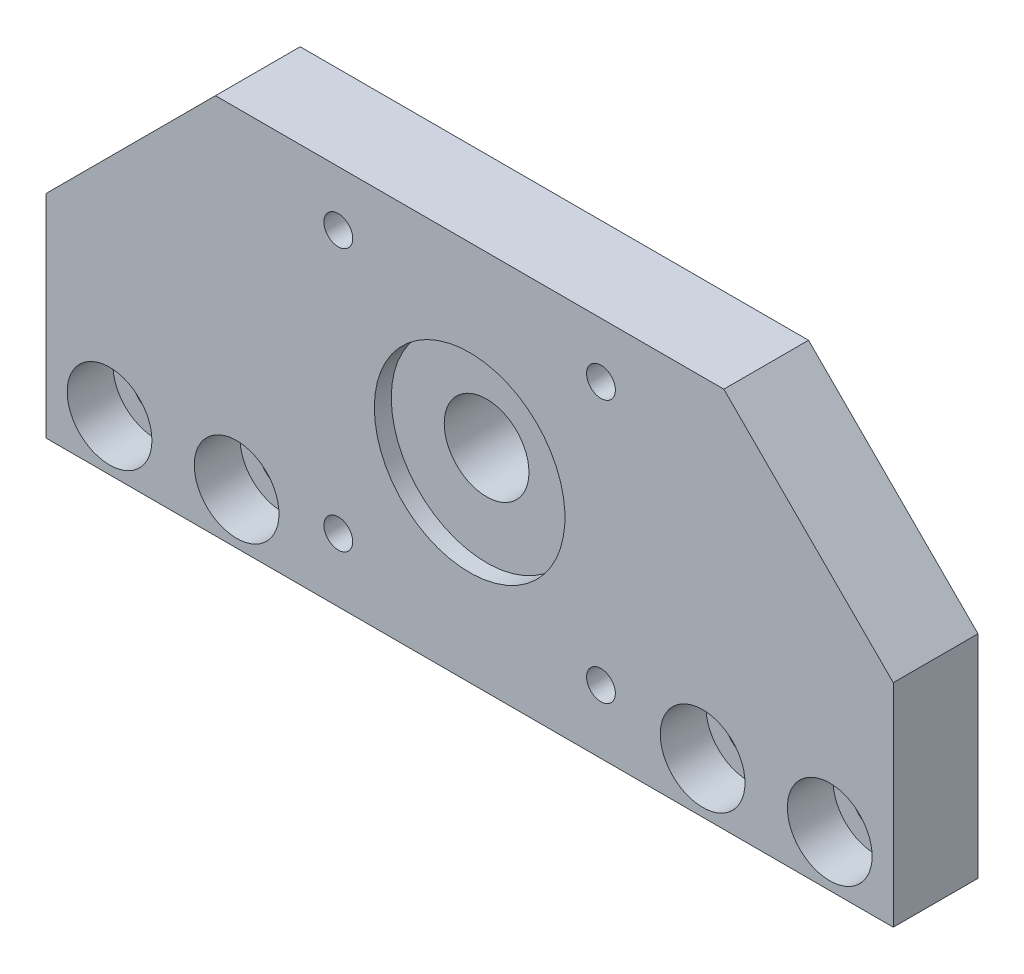
ISO-10303-21;
HEADER;
FILE_DESCRIPTION(('STEP AP214'),'2;1');
FILE_NAME('part.step','',(''),(''),'','','');
FILE_SCHEMA(('AUTOMOTIVE_DESIGN { 1 0 10303 214 1 1 1 1 }'));
ENDSEC;
DATA;
#1=APPLICATION_CONTEXT('core data for automotive mechanical design processes');
#2=APPLICATION_PROTOCOL_DEFINITION('international standard','automotive_design',2000,#1);
#3=PRODUCT_CONTEXT('',#1,'mechanical');
#4=PRODUCT('Part','Part','',(#3));
#5=PRODUCT_RELATED_PRODUCT_CATEGORY('part','',(#4));
#6=PRODUCT_DEFINITION_FORMATION('','',#4);
#7=PRODUCT_DEFINITION_CONTEXT('part definition',#1,'design');
#8=PRODUCT_DEFINITION('design','',#6,#7);
#9=PRODUCT_DEFINITION_SHAPE('','',#8);
#10=(LENGTH_UNIT() NAMED_UNIT(*) SI_UNIT(.MILLI.,.METRE.));
#11=(NAMED_UNIT(*) PLANE_ANGLE_UNIT() SI_UNIT($,.RADIAN.));
#12=(NAMED_UNIT(*) SI_UNIT($,.STERADIAN.) SOLID_ANGLE_UNIT());
#13=UNCERTAINTY_MEASURE_WITH_UNIT(LENGTH_MEASURE(1.E-05),#10,'distance_accuracy_value','');
#14=(GEOMETRIC_REPRESENTATION_CONTEXT(3) GLOBAL_UNCERTAINTY_ASSIGNED_CONTEXT((#13)) GLOBAL_UNIT_ASSIGNED_CONTEXT((#10,
#11,#12)) REPRESENTATION_CONTEXT('',''));
#15=CARTESIAN_POINT('',(0.,0.,0.));
#16=DIRECTION('',(0.,0.,1.));
#17=DIRECTION('',(1.,0.,0.));
#18=AXIS2_PLACEMENT_3D('',#15,#16,#17);
#19=CARTESIAN_POINT('',(-50.,-22.5,5.));
#20=DIRECTION('',(1.,0.,0.));
#21=DIRECTION('',(0.,0.,-1.));
#22=AXIS2_PLACEMENT_3D('',#19,#20,#21);
#23=PLANE('',#22);
#24=DIRECTION('',(0.,-1.,0.));
#25=VECTOR('',#24,1.);
#26=CARTESIAN_POINT('',(-50.,-22.5,5.));
#27=LINE('',#26,#25);
#28=CARTESIAN_POINT('',(-50.,2.49999999999997,5.));
#29=VERTEX_POINT('',#28);
#30=CARTESIAN_POINT('',(-50.,-22.5,5.));
#31=VERTEX_POINT('',#30);
#32=EDGE_CURVE('E94',#29,#31,#27,.T.);
#33=ORIENTED_EDGE('',*,*,#32,.F.);
#34=DIRECTION('',(0.,0.,-1.));
#35=VECTOR('',#34,1.);
#36=CARTESIAN_POINT('',(-50.,2.49999999999998,5.));
#37=LINE('',#36,#35);
#38=CARTESIAN_POINT('',(-50.,2.49999999999997,-5.));
#39=VERTEX_POINT('',#38);
#40=EDGE_CURVE('E11',#29,#39,#37,.T.);
#41=ORIENTED_EDGE('',*,*,#40,.T.);
#42=DIRECTION('',(0.,-1.,0.));
#43=VECTOR('',#42,1.);
#44=CARTESIAN_POINT('',(-50.,-22.5,-5.));
#45=LINE('',#44,#43);
#46=CARTESIAN_POINT('',(-50.,-22.5,-5.));
#47=VERTEX_POINT('',#46);
#48=EDGE_CURVE('E113',#39,#47,#45,.T.);
#49=ORIENTED_EDGE('',*,*,#48,.T.);
#50=DIRECTION('',(0.,0.,-1.));
#51=VECTOR('',#50,1.);
#52=CARTESIAN_POINT('',(-50.,-22.5,5.));
#53=LINE('',#52,#51);
#54=EDGE_CURVE('E107',#31,#47,#53,.T.);
#55=ORIENTED_EDGE('',*,*,#54,.F.);
#56=EDGE_LOOP('',(#33,#41,#49,#55));
#57=FACE_BOUND('',#56,.T.);
#58=ADVANCED_FACE('F39',(#57),#23,.F.);
#59=CARTESIAN_POINT('',(50.,-22.5,5.));
#60=DIRECTION('',(0.,1.,0.));
#61=DIRECTION('',(-1.,0.,0.));
#62=AXIS2_PLACEMENT_3D('',#59,#60,#61);
#63=PLANE('',#62);
#64=DIRECTION('',(1.,0.,0.));
#65=VECTOR('',#64,1.);
#66=CARTESIAN_POINT('',(50.,-22.5,-5.));
#67=LINE('',#66,#65);
#68=CARTESIAN_POINT('',(50.,-22.5,-5.));
#69=VERTEX_POINT('',#68);
#70=EDGE_CURVE('E147',#47,#69,#67,.T.);
#71=ORIENTED_EDGE('',*,*,#70,.T.);
#72=DIRECTION('',(0.,0.,-1.));
#73=VECTOR('',#72,1.);
#74=CARTESIAN_POINT('',(50.,-22.5,5.));
#75=LINE('',#74,#73);
#76=CARTESIAN_POINT('',(50.,-22.5,5.));
#77=VERTEX_POINT('',#76);
#78=EDGE_CURVE('E109',#77,#69,#75,.T.);
#79=ORIENTED_EDGE('',*,*,#78,.F.);
#80=DIRECTION('',(1.,0.,0.));
#81=VECTOR('',#80,1.);
#82=CARTESIAN_POINT('',(50.,-22.5,5.));
#83=LINE('',#82,#81);
#84=EDGE_CURVE('E97',#31,#77,#83,.T.);
#85=ORIENTED_EDGE('',*,*,#84,.F.);
#86=ORIENTED_EDGE('',*,*,#54,.T.);
#87=EDGE_LOOP('',(#71,#79,#85,#86));
#88=FACE_BOUND('',#87,.T.);
#89=ADVANCED_FACE('F106',(#88),#63,.F.);
#90=CARTESIAN_POINT('',(50.,-22.5,5.));
#91=DIRECTION('',(-1.,0.,0.));
#92=DIRECTION('',(0.,0.,1.));
#93=AXIS2_PLACEMENT_3D('',#90,#91,#92);
#94=PLANE('',#93);
#95=DIRECTION('',(0.,1.,0.));
#96=VECTOR('',#95,1.);
#97=CARTESIAN_POINT('',(50.,-22.5,-5.));
#98=LINE('',#97,#96);
#99=CARTESIAN_POINT('',(50.,2.49999999999989,-5.));
#100=VERTEX_POINT('',#99);
#101=EDGE_CURVE('E145',#69,#100,#98,.T.);
#102=ORIENTED_EDGE('',*,*,#101,.T.);
#103=DIRECTION('',(0.,0.,1.));
#104=VECTOR('',#103,1.);
#105=CARTESIAN_POINT('',(50.,2.4999999999999,5.));
#106=LINE('',#105,#104);
#107=CARTESIAN_POINT('',(50.,2.49999999999989,5.));
#108=VERTEX_POINT('',#107);
#109=EDGE_CURVE('E64',#100,#108,#106,.T.);
#110=ORIENTED_EDGE('',*,*,#109,.T.);
#111=DIRECTION('',(0.,1.,0.));
#112=VECTOR('',#111,1.);
#113=CARTESIAN_POINT('',(50.,-22.5,5.));
#114=LINE('',#113,#112);
#115=EDGE_CURVE('E110',#77,#108,#114,.T.);
#116=ORIENTED_EDGE('',*,*,#115,.F.);
#117=ORIENTED_EDGE('',*,*,#78,.T.);
#118=EDGE_LOOP('',(#102,#110,#116,#117));
#119=FACE_BOUND('',#118,.T.);
#120=ADVANCED_FACE('F146',(#119),#94,.F.);
#121=CARTESIAN_POINT('',(50.,22.5,5.));
#122=DIRECTION('',(0.,-1.,0.));
#123=DIRECTION('',(1.,0.,0.));
#124=AXIS2_PLACEMENT_3D('',#121,#122,#123);
#125=PLANE('',#124);
#126=DIRECTION('',(-1.,0.,0.));
#127=VECTOR('',#126,1.);
#128=CARTESIAN_POINT('',(50.,22.5,5.));
#129=LINE('',#128,#127);
#130=CARTESIAN_POINT('',(30.,22.5,5.));
#131=VERTEX_POINT('',#130);
#132=CARTESIAN_POINT('',(-29.9999999999999,22.5,5.));
#133=VERTEX_POINT('',#132);
#134=EDGE_CURVE('E119',#131,#133,#129,.T.);
#135=ORIENTED_EDGE('',*,*,#134,.F.);
#136=DIRECTION('',(0.,0.,-1.));
#137=VECTOR('',#136,1.);
#138=CARTESIAN_POINT('',(30.,22.5,5.));
#139=LINE('',#138,#137);
#140=CARTESIAN_POINT('',(30.,22.5,-5.));
#141=VERTEX_POINT('',#140);
#142=EDGE_CURVE('E117',#131,#141,#139,.T.);
#143=ORIENTED_EDGE('',*,*,#142,.T.);
#144=DIRECTION('',(-1.,0.,0.));
#145=VECTOR('',#144,1.);
#146=CARTESIAN_POINT('',(50.,22.5,-5.));
#147=LINE('',#146,#145);
#148=CARTESIAN_POINT('',(-29.9999999999999,22.5,-5.));
#149=VERTEX_POINT('',#148);
#150=EDGE_CURVE('E102',#141,#149,#147,.T.);
#151=ORIENTED_EDGE('',*,*,#150,.T.);
#152=DIRECTION('',(0.,0.,1.));
#153=VECTOR('',#152,1.);
#154=CARTESIAN_POINT('',(-29.9999999999999,22.5,5.));
#155=LINE('',#154,#153);
#156=EDGE_CURVE('E115',#149,#133,#155,.T.);
#157=ORIENTED_EDGE('',*,*,#156,.T.);
#158=EDGE_LOOP('',(#135,#143,#151,#157));
#159=FACE_BOUND('',#158,.T.);
#160=ADVANCED_FACE('F136',(#159),#125,.F.);
#161=CARTESIAN_POINT('',(0.,0.,5.));
#162=DIRECTION('',(0.,0.,1.));
#163=DIRECTION('',(1.,0.,0.));
#164=AXIS2_PLACEMENT_3D('',#161,#162,#163);
#165=PLANE('',#164);
#166=CARTESIAN_POINT('',(0.,0.,5.));
#167=DIRECTION('',(0.,0.,-1.));
#168=DIRECTION('',(-1.,0.,0.));
#169=AXIS2_PLACEMENT_3D('',#166,#167,#168);
#170=CIRCLE('',#169,11.25);
#171=CARTESIAN_POINT('',(-11.25,0.,5.));
#172=VERTEX_POINT('',#171);
#173=EDGE_CURVE('E252',#172,#172,#170,.T.);
#174=ORIENTED_EDGE('',*,*,#173,.T.);
#175=EDGE_LOOP('',(#174));
#176=FACE_BOUND('',#175,.T.);
#177=CARTESIAN_POINT('',(-15.5,16.,5.));
#178=DIRECTION('',(0.,0.,-1.));
#179=DIRECTION('',(-1.,0.,0.));
#180=AXIS2_PLACEMENT_3D('',#177,#178,#179);
#181=CIRCLE('',#180,1.7);
#182=CARTESIAN_POINT('',(-17.2,16.,5.));
#183=VERTEX_POINT('',#182);
#184=EDGE_CURVE('E237',#183,#183,#181,.T.);
#185=ORIENTED_EDGE('',*,*,#184,.T.);
#186=EDGE_LOOP('',(#185));
#187=FACE_BOUND('',#186,.T.);
#188=CARTESIAN_POINT('',(15.5,16.,5.));
#189=DIRECTION('',(0.,0.,-1.));
#190=DIRECTION('',(-1.,0.,0.));
#191=AXIS2_PLACEMENT_3D('',#188,#189,#190);
#192=CIRCLE('',#191,1.7);
#193=CARTESIAN_POINT('',(13.8,16.,5.));
#194=VERTEX_POINT('',#193);
#195=EDGE_CURVE('E225',#194,#194,#192,.T.);
#196=ORIENTED_EDGE('',*,*,#195,.T.);
#197=EDGE_LOOP('',(#196));
#198=FACE_BOUND('',#197,.T.);
#199=CARTESIAN_POINT('',(15.5,-15.,5.));
#200=DIRECTION('',(0.,0.,-1.));
#201=DIRECTION('',(-1.,0.,0.));
#202=AXIS2_PLACEMENT_3D('',#199,#200,#201);
#203=CIRCLE('',#202,1.7);
#204=CARTESIAN_POINT('',(13.8,-15.,5.));
#205=VERTEX_POINT('',#204);
#206=EDGE_CURVE('E213',#205,#205,#203,.T.);
#207=ORIENTED_EDGE('',*,*,#206,.T.);
#208=EDGE_LOOP('',(#207));
#209=FACE_BOUND('',#208,.T.);
#210=CARTESIAN_POINT('',(-15.5,-15.,5.));
#211=DIRECTION('',(0.,0.,-1.));
#212=DIRECTION('',(-1.,0.,0.));
#213=AXIS2_PLACEMENT_3D('',#210,#211,#212);
#214=CIRCLE('',#213,1.7);
#215=CARTESIAN_POINT('',(-17.2,-15.,5.));
#216=VERTEX_POINT('',#215);
#217=EDGE_CURVE('E201',#216,#216,#214,.T.);
#218=ORIENTED_EDGE('',*,*,#217,.T.);
#219=EDGE_LOOP('',(#218));
#220=FACE_BOUND('',#219,.T.);
#221=CARTESIAN_POINT('',(-42.5,-16.5,5.));
#222=DIRECTION('',(0.,0.,1.));
#223=DIRECTION('',(1.,0.,0.));
#224=AXIS2_PLACEMENT_3D('',#221,#222,#223);
#225=CIRCLE('',#224,5.);
#226=CARTESIAN_POINT('',(-37.5,-16.5,5.));
#227=VERTEX_POINT('',#226);
#228=EDGE_CURVE('E198',#227,#227,#225,.T.);
#229=ORIENTED_EDGE('',*,*,#228,.F.);
#230=EDGE_LOOP('',(#229));
#231=FACE_BOUND('',#230,.T.);
#232=CARTESIAN_POINT('',(-27.5,-16.5,5.));
#233=DIRECTION('',(0.,0.,1.));
#234=DIRECTION('',(1.,0.,0.));
#235=AXIS2_PLACEMENT_3D('',#232,#233,#234);
#236=CIRCLE('',#235,5.);
#237=CARTESIAN_POINT('',(-22.5,-16.5,5.));
#238=VERTEX_POINT('',#237);
#239=EDGE_CURVE('E186',#238,#238,#236,.T.);
#240=ORIENTED_EDGE('',*,*,#239,.F.);
#241=EDGE_LOOP('',(#240));
#242=FACE_BOUND('',#241,.T.);
#243=CARTESIAN_POINT('',(27.5,-16.5,5.));
#244=DIRECTION('',(0.,0.,1.));
#245=DIRECTION('',(1.,0.,0.));
#246=AXIS2_PLACEMENT_3D('',#243,#244,#245);
#247=CIRCLE('',#246,5.);
#248=CARTESIAN_POINT('',(32.5,-16.5,5.));
#249=VERTEX_POINT('',#248);
#250=EDGE_CURVE('E174',#249,#249,#247,.T.);
#251=ORIENTED_EDGE('',*,*,#250,.F.);
#252=EDGE_LOOP('',(#251));
#253=FACE_BOUND('',#252,.T.);
#254=CARTESIAN_POINT('',(42.5,-16.5,5.));
#255=DIRECTION('',(0.,0.,1.));
#256=DIRECTION('',(1.,0.,0.));
#257=AXIS2_PLACEMENT_3D('',#254,#255,#256);
#258=CIRCLE('',#257,5.);
#259=CARTESIAN_POINT('',(47.5,-16.5,5.));
#260=VERTEX_POINT('',#259);
#261=EDGE_CURVE('E162',#260,#260,#258,.T.);
#262=ORIENTED_EDGE('',*,*,#261,.F.);
#263=EDGE_LOOP('',(#262));
#264=FACE_BOUND('',#263,.T.);
#265=ORIENTED_EDGE('',*,*,#115,.T.);
#266=DIRECTION('',(0.707106781186546,-0.707106781186549,0.));
#267=VECTOR('',#266,1.);
#268=CARTESIAN_POINT('',(26.25,26.2499999999999,5.));
#269=LINE('',#268,#267);
#270=EDGE_CURVE('E49',#108,#131,#269,.F.);
#271=ORIENTED_EDGE('',*,*,#270,.T.);
#272=ORIENTED_EDGE('',*,*,#134,.T.);
#273=DIRECTION('',(0.707106781186549,0.707106781186546,0.));
#274=VECTOR('',#273,1.);
#275=CARTESIAN_POINT('',(-26.2499999999999,26.25,5.));
#276=LINE('',#275,#274);
#277=EDGE_CURVE('E56',#133,#29,#276,.F.);
#278=ORIENTED_EDGE('',*,*,#277,.T.);
#279=ORIENTED_EDGE('',*,*,#32,.T.);
#280=ORIENTED_EDGE('',*,*,#84,.T.);
#281=EDGE_LOOP('',(#265,#271,#272,#278,#279,#280));
#282=FACE_BOUND('',#281,.T.);
#283=ADVANCED_FACE('F96',(#176,#187,#198,#209,#220,#231,#242,#253,#264,#282),#165,.T.);
#284=CARTESIAN_POINT('',(0.,0.,-5.));
#285=DIRECTION('',(0.,0.,1.));
#286=DIRECTION('',(1.,0.,0.));
#287=AXIS2_PLACEMENT_3D('',#284,#285,#286);
#288=PLANE('',#287);
#289=CARTESIAN_POINT('',(0.,0.500000000000004,-5.));
#290=DIRECTION('',(0.,0.,1.));
#291=DIRECTION('',(1.,0.,0.));
#292=AXIS2_PLACEMENT_3D('',#289,#290,#291);
#293=CIRCLE('',#292,5.);
#294=CARTESIAN_POINT('',(5.00000000000001,0.500000000000004,-5.));
#295=VERTEX_POINT('',#294);
#296=EDGE_CURVE('E249',#295,#295,#293,.T.);
#297=ORIENTED_EDGE('',*,*,#296,.T.);
#298=EDGE_LOOP('',(#297));
#299=FACE_BOUND('',#298,.T.);
#300=CARTESIAN_POINT('',(-15.5,16.,-5.));
#301=DIRECTION('',(0.,0.,-1.));
#302=DIRECTION('',(-1.,0.,0.));
#303=AXIS2_PLACEMENT_3D('',#300,#301,#302);
#304=CIRCLE('',#303,3.25);
#305=CARTESIAN_POINT('',(-18.75,16.,-5.));
#306=VERTEX_POINT('',#305);
#307=EDGE_CURVE('E246',#306,#306,#304,.T.);
#308=ORIENTED_EDGE('',*,*,#307,.F.);
#309=EDGE_LOOP('',(#308));
#310=FACE_BOUND('',#309,.T.);
#311=CARTESIAN_POINT('',(15.5,16.,-5.));
#312=DIRECTION('',(0.,0.,-1.));
#313=DIRECTION('',(-1.,0.,0.));
#314=AXIS2_PLACEMENT_3D('',#311,#312,#313);
#315=CIRCLE('',#314,3.25);
#316=CARTESIAN_POINT('',(12.25,16.,-5.));
#317=VERTEX_POINT('',#316);
#318=EDGE_CURVE('E234',#317,#317,#315,.T.);
#319=ORIENTED_EDGE('',*,*,#318,.F.);
#320=EDGE_LOOP('',(#319));
#321=FACE_BOUND('',#320,.T.);
#322=CARTESIAN_POINT('',(15.5,-15.,-5.));
#323=DIRECTION('',(0.,0.,-1.));
#324=DIRECTION('',(-1.,0.,0.));
#325=AXIS2_PLACEMENT_3D('',#322,#323,#324);
#326=CIRCLE('',#325,3.25);
#327=CARTESIAN_POINT('',(12.25,-15.,-5.));
#328=VERTEX_POINT('',#327);
#329=EDGE_CURVE('E222',#328,#328,#326,.T.);
#330=ORIENTED_EDGE('',*,*,#329,.F.);
#331=EDGE_LOOP('',(#330));
#332=FACE_BOUND('',#331,.T.);
#333=CARTESIAN_POINT('',(-15.5,-15.,-5.));
#334=DIRECTION('',(0.,0.,-1.));
#335=DIRECTION('',(-1.,0.,0.));
#336=AXIS2_PLACEMENT_3D('',#333,#334,#335);
#337=CIRCLE('',#336,3.25);
#338=CARTESIAN_POINT('',(-18.75,-15.,-5.));
#339=VERTEX_POINT('',#338);
#340=EDGE_CURVE('E210',#339,#339,#337,.T.);
#341=ORIENTED_EDGE('',*,*,#340,.F.);
#342=EDGE_LOOP('',(#341));
#343=FACE_BOUND('',#342,.T.);
#344=CARTESIAN_POINT('',(-42.5,-16.5,-5.));
#345=DIRECTION('',(0.,0.,1.));
#346=DIRECTION('',(1.,0.,0.));
#347=AXIS2_PLACEMENT_3D('',#344,#345,#346);
#348=CIRCLE('',#347,2.75);
#349=CARTESIAN_POINT('',(-39.75,-16.5,-5.));
#350=VERTEX_POINT('',#349);
#351=EDGE_CURVE('E189',#350,#350,#348,.T.);
#352=ORIENTED_EDGE('',*,*,#351,.T.);
#353=EDGE_LOOP('',(#352));
#354=FACE_BOUND('',#353,.T.);
#355=CARTESIAN_POINT('',(-27.5,-16.5,-5.));
#356=DIRECTION('',(0.,0.,1.));
#357=DIRECTION('',(1.,0.,0.));
#358=AXIS2_PLACEMENT_3D('',#355,#356,#357);
#359=CIRCLE('',#358,2.75);
#360=CARTESIAN_POINT('',(-24.75,-16.5,-5.));
#361=VERTEX_POINT('',#360);
#362=EDGE_CURVE('E177',#361,#361,#359,.T.);
#363=ORIENTED_EDGE('',*,*,#362,.T.);
#364=EDGE_LOOP('',(#363));
#365=FACE_BOUND('',#364,.T.);
#366=CARTESIAN_POINT('',(27.5,-16.5,-5.));
#367=DIRECTION('',(0.,0.,1.));
#368=DIRECTION('',(1.,0.,0.));
#369=AXIS2_PLACEMENT_3D('',#366,#367,#368);
#370=CIRCLE('',#369,2.75);
#371=CARTESIAN_POINT('',(30.25,-16.5,-5.));
#372=VERTEX_POINT('',#371);
#373=EDGE_CURVE('E165',#372,#372,#370,.T.);
#374=ORIENTED_EDGE('',*,*,#373,.T.);
#375=EDGE_LOOP('',(#374));
#376=FACE_BOUND('',#375,.T.);
#377=CARTESIAN_POINT('',(42.5,-16.5,-5.));
#378=DIRECTION('',(0.,0.,1.));
#379=DIRECTION('',(1.,0.,0.));
#380=AXIS2_PLACEMENT_3D('',#377,#378,#379);
#381=CIRCLE('',#380,2.75);
#382=CARTESIAN_POINT('',(45.25,-16.5,-5.));
#383=VERTEX_POINT('',#382);
#384=EDGE_CURVE('E151',#383,#383,#381,.T.);
#385=ORIENTED_EDGE('',*,*,#384,.T.);
#386=EDGE_LOOP('',(#385));
#387=FACE_BOUND('',#386,.T.);
#388=ORIENTED_EDGE('',*,*,#150,.F.);
#389=DIRECTION('',(-0.707106781186546,0.707106781186549,0.));
#390=VECTOR('',#389,1.);
#391=CARTESIAN_POINT('',(30.,22.5,-5.));
#392=LINE('',#391,#390);
#393=EDGE_CURVE('E127',#141,#100,#392,.F.);
#394=ORIENTED_EDGE('',*,*,#393,.T.);
#395=ORIENTED_EDGE('',*,*,#101,.F.);
#396=ORIENTED_EDGE('',*,*,#70,.F.);
#397=ORIENTED_EDGE('',*,*,#48,.F.);
#398=DIRECTION('',(-0.707106781186549,-0.707106781186546,0.));
#399=VECTOR('',#398,1.);
#400=CARTESIAN_POINT('',(-50.,2.49999999999998,-5.));
#401=LINE('',#400,#399);
#402=EDGE_CURVE('E125',#39,#149,#401,.F.);
#403=ORIENTED_EDGE('',*,*,#402,.T.);
#404=EDGE_LOOP('',(#388,#394,#395,#396,#397,#403));
#405=FACE_BOUND('',#404,.T.);
#406=ADVANCED_FACE('F144',(#299,#310,#321,#332,#343,#354,#365,#376,#387,#405),#288,.F.);
#407=CARTESIAN_POINT('',(30.,22.5,5.));
#408=DIRECTION('',(-0.707106781186549,-0.707106781186546,0.));
#409=DIRECTION('',(0.,0.,-1.));
#410=AXIS2_PLACEMENT_3D('',#407,#408,#409);
#411=PLANE('',#410);
#412=ORIENTED_EDGE('',*,*,#270,.F.);
#413=ORIENTED_EDGE('',*,*,#109,.F.);
#414=ORIENTED_EDGE('',*,*,#393,.F.);
#415=ORIENTED_EDGE('',*,*,#142,.F.);
#416=EDGE_LOOP('',(#412,#413,#414,#415));
#417=FACE_BOUND('',#416,.T.);
#418=ADVANCED_FACE('F141',(#417),#411,.F.);
#419=CARTESIAN_POINT('',(-50.,2.49999999999998,5.));
#420=DIRECTION('',(0.707106781186546,-0.707106781186549,0.));
#421=DIRECTION('',(0.,0.,-1.));
#422=AXIS2_PLACEMENT_3D('',#419,#420,#421);
#423=PLANE('',#422);
#424=ORIENTED_EDGE('',*,*,#277,.F.);
#425=ORIENTED_EDGE('',*,*,#156,.F.);
#426=ORIENTED_EDGE('',*,*,#402,.F.);
#427=ORIENTED_EDGE('',*,*,#40,.F.);
#428=EDGE_LOOP('',(#424,#425,#426,#427));
#429=FACE_BOUND('',#428,.T.);
#430=ADVANCED_FACE('F42',(#429),#423,.F.);
#431=CARTESIAN_POINT('',(42.5,-16.5,5.));
#432=DIRECTION('',(0.,0.,1.));
#433=DIRECTION('',(1.,0.,0.));
#434=AXIS2_PLACEMENT_3D('',#431,#432,#433);
#435=CYLINDRICAL_SURFACE('',#434,2.75);
#436=ORIENTED_EDGE('',*,*,#384,.F.);
#437=EDGE_LOOP('',(#436));
#438=FACE_BOUND('',#437,.T.);
#439=CARTESIAN_POINT('',(42.5,-16.5,-0.4));
#440=DIRECTION('',(0.,0.,1.));
#441=DIRECTION('',(1.,0.,0.));
#442=AXIS2_PLACEMENT_3D('',#439,#440,#441);
#443=CIRCLE('',#442,2.75);
#444=CARTESIAN_POINT('',(45.25,-16.5,-0.4));
#445=VERTEX_POINT('',#444);
#446=EDGE_CURVE('E156',#445,#445,#443,.T.);
#447=ORIENTED_EDGE('',*,*,#446,.T.);
#448=EDGE_LOOP('',(#447));
#449=FACE_BOUND('',#448,.T.);
#450=ADVANCED_FACE('F293',(#438,#449),#435,.F.);
#451=CARTESIAN_POINT('',(45.25,-16.5,-0.4));
#452=DIRECTION('',(0.,0.,-1.));
#453=DIRECTION('',(-1.,0.,0.));
#454=AXIS2_PLACEMENT_3D('',#451,#452,#453);
#455=PLANE('',#454);
#456=ORIENTED_EDGE('',*,*,#446,.F.);
#457=EDGE_LOOP('',(#456));
#458=FACE_BOUND('',#457,.T.);
#459=CARTESIAN_POINT('',(42.5,-16.5,-0.4));
#460=DIRECTION('',(0.,0.,1.));
#461=DIRECTION('',(1.,0.,0.));
#462=AXIS2_PLACEMENT_3D('',#459,#460,#461);
#463=CIRCLE('',#462,5.);
#464=CARTESIAN_POINT('',(47.5,-16.5,-0.4));
#465=VERTEX_POINT('',#464);
#466=EDGE_CURVE('E159',#465,#465,#463,.T.);
#467=ORIENTED_EDGE('',*,*,#466,.T.);
#468=EDGE_LOOP('',(#467));
#469=FACE_BOUND('',#468,.T.);
#470=ADVANCED_FACE('F562',(#458,#469),#455,.F.);
#471=CARTESIAN_POINT('',(42.5,-16.5,5.));
#472=DIRECTION('',(0.,0.,1.));
#473=DIRECTION('',(1.,0.,0.));
#474=AXIS2_PLACEMENT_3D('',#471,#472,#473);
#475=CYLINDRICAL_SURFACE('',#474,5.);
#476=ORIENTED_EDGE('',*,*,#466,.F.);
#477=EDGE_LOOP('',(#476));
#478=FACE_BOUND('',#477,.T.);
#479=ORIENTED_EDGE('',*,*,#261,.T.);
#480=EDGE_LOOP('',(#479));
#481=FACE_BOUND('',#480,.T.);
#482=ADVANCED_FACE('F552',(#478,#481),#475,.F.);
#483=CARTESIAN_POINT('',(27.5,-16.5,5.));
#484=DIRECTION('',(0.,0.,1.));
#485=DIRECTION('',(1.,0.,0.));
#486=AXIS2_PLACEMENT_3D('',#483,#484,#485);
#487=CYLINDRICAL_SURFACE('',#486,2.75);
#488=ORIENTED_EDGE('',*,*,#373,.F.);
#489=EDGE_LOOP('',(#488));
#490=FACE_BOUND('',#489,.T.);
#491=CARTESIAN_POINT('',(27.5,-16.5,-0.4));
#492=DIRECTION('',(0.,0.,1.));
#493=DIRECTION('',(1.,0.,0.));
#494=AXIS2_PLACEMENT_3D('',#491,#492,#493);
#495=CIRCLE('',#494,2.75);
#496=CARTESIAN_POINT('',(30.25,-16.5,-0.4));
#497=VERTEX_POINT('',#496);
#498=EDGE_CURVE('E168',#497,#497,#495,.T.);
#499=ORIENTED_EDGE('',*,*,#498,.T.);
#500=EDGE_LOOP('',(#499));
#501=FACE_BOUND('',#500,.T.);
#502=ADVANCED_FACE('F542',(#490,#501),#487,.F.);
#503=CARTESIAN_POINT('',(30.25,-16.5,-0.4));
#504=DIRECTION('',(0.,0.,-1.));
#505=DIRECTION('',(-1.,0.,0.));
#506=AXIS2_PLACEMENT_3D('',#503,#504,#505);
#507=PLANE('',#506);
#508=ORIENTED_EDGE('',*,*,#498,.F.);
#509=EDGE_LOOP('',(#508));
#510=FACE_BOUND('',#509,.T.);
#511=CARTESIAN_POINT('',(27.5,-16.5,-0.4));
#512=DIRECTION('',(0.,0.,1.));
#513=DIRECTION('',(1.,0.,0.));
#514=AXIS2_PLACEMENT_3D('',#511,#512,#513);
#515=CIRCLE('',#514,5.);
#516=CARTESIAN_POINT('',(32.5,-16.5,-0.4));
#517=VERTEX_POINT('',#516);
#518=EDGE_CURVE('E171',#517,#517,#515,.T.);
#519=ORIENTED_EDGE('',*,*,#518,.T.);
#520=EDGE_LOOP('',(#519));
#521=FACE_BOUND('',#520,.T.);
#522=ADVANCED_FACE('F532',(#510,#521),#507,.F.);
#523=CARTESIAN_POINT('',(27.5,-16.5,5.));
#524=DIRECTION('',(0.,0.,1.));
#525=DIRECTION('',(1.,0.,0.));
#526=AXIS2_PLACEMENT_3D('',#523,#524,#525);
#527=CYLINDRICAL_SURFACE('',#526,5.);
#528=ORIENTED_EDGE('',*,*,#518,.F.);
#529=EDGE_LOOP('',(#528));
#530=FACE_BOUND('',#529,.T.);
#531=ORIENTED_EDGE('',*,*,#250,.T.);
#532=EDGE_LOOP('',(#531));
#533=FACE_BOUND('',#532,.T.);
#534=ADVANCED_FACE('F522',(#530,#533),#527,.F.);
#535=CARTESIAN_POINT('',(-27.5,-16.5,5.));
#536=DIRECTION('',(0.,0.,1.));
#537=DIRECTION('',(1.,0.,0.));
#538=AXIS2_PLACEMENT_3D('',#535,#536,#537);
#539=CYLINDRICAL_SURFACE('',#538,2.75);
#540=ORIENTED_EDGE('',*,*,#362,.F.);
#541=EDGE_LOOP('',(#540));
#542=FACE_BOUND('',#541,.T.);
#543=CARTESIAN_POINT('',(-27.5,-16.5,-0.4));
#544=DIRECTION('',(0.,0.,1.));
#545=DIRECTION('',(1.,0.,0.));
#546=AXIS2_PLACEMENT_3D('',#543,#544,#545);
#547=CIRCLE('',#546,2.75);
#548=CARTESIAN_POINT('',(-24.75,-16.5,-0.4));
#549=VERTEX_POINT('',#548);
#550=EDGE_CURVE('E180',#549,#549,#547,.T.);
#551=ORIENTED_EDGE('',*,*,#550,.T.);
#552=EDGE_LOOP('',(#551));
#553=FACE_BOUND('',#552,.T.);
#554=ADVANCED_FACE('F512',(#542,#553),#539,.F.);
#555=CARTESIAN_POINT('',(-24.75,-16.5,-0.4));
#556=DIRECTION('',(0.,0.,-1.));
#557=DIRECTION('',(-1.,0.,0.));
#558=AXIS2_PLACEMENT_3D('',#555,#556,#557);
#559=PLANE('',#558);
#560=ORIENTED_EDGE('',*,*,#550,.F.);
#561=EDGE_LOOP('',(#560));
#562=FACE_BOUND('',#561,.T.);
#563=CARTESIAN_POINT('',(-27.5,-16.5,-0.4));
#564=DIRECTION('',(0.,0.,1.));
#565=DIRECTION('',(1.,0.,0.));
#566=AXIS2_PLACEMENT_3D('',#563,#564,#565);
#567=CIRCLE('',#566,5.);
#568=CARTESIAN_POINT('',(-22.5,-16.5,-0.4));
#569=VERTEX_POINT('',#568);
#570=EDGE_CURVE('E183',#569,#569,#567,.T.);
#571=ORIENTED_EDGE('',*,*,#570,.T.);
#572=EDGE_LOOP('',(#571));
#573=FACE_BOUND('',#572,.T.);
#574=ADVANCED_FACE('F502',(#562,#573),#559,.F.);
#575=CARTESIAN_POINT('',(-27.5,-16.5,5.));
#576=DIRECTION('',(0.,0.,1.));
#577=DIRECTION('',(1.,0.,0.));
#578=AXIS2_PLACEMENT_3D('',#575,#576,#577);
#579=CYLINDRICAL_SURFACE('',#578,5.);
#580=ORIENTED_EDGE('',*,*,#570,.F.);
#581=EDGE_LOOP('',(#580));
#582=FACE_BOUND('',#581,.T.);
#583=ORIENTED_EDGE('',*,*,#239,.T.);
#584=EDGE_LOOP('',(#583));
#585=FACE_BOUND('',#584,.T.);
#586=ADVANCED_FACE('F492',(#582,#585),#579,.F.);
#587=CARTESIAN_POINT('',(-42.5,-16.5,5.));
#588=DIRECTION('',(0.,0.,1.));
#589=DIRECTION('',(1.,0.,0.));
#590=AXIS2_PLACEMENT_3D('',#587,#588,#589);
#591=CYLINDRICAL_SURFACE('',#590,2.75);
#592=ORIENTED_EDGE('',*,*,#351,.F.);
#593=EDGE_LOOP('',(#592));
#594=FACE_BOUND('',#593,.T.);
#595=CARTESIAN_POINT('',(-42.5,-16.5,-0.4));
#596=DIRECTION('',(0.,0.,1.));
#597=DIRECTION('',(1.,0.,0.));
#598=AXIS2_PLACEMENT_3D('',#595,#596,#597);
#599=CIRCLE('',#598,2.75);
#600=CARTESIAN_POINT('',(-39.75,-16.5,-0.4));
#601=VERTEX_POINT('',#600);
#602=EDGE_CURVE('E192',#601,#601,#599,.T.);
#603=ORIENTED_EDGE('',*,*,#602,.T.);
#604=EDGE_LOOP('',(#603));
#605=FACE_BOUND('',#604,.T.);
#606=ADVANCED_FACE('F482',(#594,#605),#591,.F.);
#607=CARTESIAN_POINT('',(-39.75,-16.5,-0.4));
#608=DIRECTION('',(0.,0.,-1.));
#609=DIRECTION('',(-1.,0.,0.));
#610=AXIS2_PLACEMENT_3D('',#607,#608,#609);
#611=PLANE('',#610);
#612=ORIENTED_EDGE('',*,*,#602,.F.);
#613=EDGE_LOOP('',(#612));
#614=FACE_BOUND('',#613,.T.);
#615=CARTESIAN_POINT('',(-42.5,-16.5,-0.4));
#616=DIRECTION('',(0.,0.,1.));
#617=DIRECTION('',(1.,0.,0.));
#618=AXIS2_PLACEMENT_3D('',#615,#616,#617);
#619=CIRCLE('',#618,5.);
#620=CARTESIAN_POINT('',(-37.5,-16.5,-0.4));
#621=VERTEX_POINT('',#620);
#622=EDGE_CURVE('E195',#621,#621,#619,.T.);
#623=ORIENTED_EDGE('',*,*,#622,.T.);
#624=EDGE_LOOP('',(#623));
#625=FACE_BOUND('',#624,.T.);
#626=ADVANCED_FACE('F472',(#614,#625),#611,.F.);
#627=CARTESIAN_POINT('',(-42.5,-16.5,5.));
#628=DIRECTION('',(0.,0.,1.));
#629=DIRECTION('',(1.,0.,0.));
#630=AXIS2_PLACEMENT_3D('',#627,#628,#629);
#631=CYLINDRICAL_SURFACE('',#630,5.);
#632=ORIENTED_EDGE('',*,*,#622,.F.);
#633=EDGE_LOOP('',(#632));
#634=FACE_BOUND('',#633,.T.);
#635=ORIENTED_EDGE('',*,*,#228,.T.);
#636=EDGE_LOOP('',(#635));
#637=FACE_BOUND('',#636,.T.);
#638=ADVANCED_FACE('F462',(#634,#637),#631,.F.);
#639=CARTESIAN_POINT('',(-15.5,-15.,-5.));
#640=DIRECTION('',(0.,0.,-1.));
#641=DIRECTION('',(-1.,0.,0.));
#642=AXIS2_PLACEMENT_3D('',#639,#640,#641);
#643=CYLINDRICAL_SURFACE('',#642,1.7);
#644=ORIENTED_EDGE('',*,*,#217,.F.);
#645=EDGE_LOOP('',(#644));
#646=FACE_BOUND('',#645,.T.);
#647=CARTESIAN_POINT('',(-15.5,-15.,-1.6));
#648=DIRECTION('',(0.,0.,-1.));
#649=DIRECTION('',(-1.,0.,0.));
#650=AXIS2_PLACEMENT_3D('',#647,#648,#649);
#651=CIRCLE('',#650,1.7);
#652=CARTESIAN_POINT('',(-17.2,-15.,-1.6));
#653=VERTEX_POINT('',#652);
#654=EDGE_CURVE('E204',#653,#653,#651,.T.);
#655=ORIENTED_EDGE('',*,*,#654,.T.);
#656=EDGE_LOOP('',(#655));
#657=FACE_BOUND('',#656,.T.);
#658=ADVANCED_FACE('F452',(#646,#657),#643,.F.);
#659=CARTESIAN_POINT('',(-13.8,-15.,-1.6));
#660=DIRECTION('',(0.,0.,1.));
#661=DIRECTION('',(1.,0.,0.));
#662=AXIS2_PLACEMENT_3D('',#659,#660,#661);
#663=PLANE('',#662);
#664=ORIENTED_EDGE('',*,*,#654,.F.);
#665=EDGE_LOOP('',(#664));
#666=FACE_BOUND('',#665,.T.);
#667=CARTESIAN_POINT('',(-15.5,-15.,-1.6));
#668=DIRECTION('',(0.,0.,-1.));
#669=DIRECTION('',(-1.,0.,0.));
#670=AXIS2_PLACEMENT_3D('',#667,#668,#669);
#671=CIRCLE('',#670,3.25);
#672=CARTESIAN_POINT('',(-18.75,-15.,-1.6));
#673=VERTEX_POINT('',#672);
#674=EDGE_CURVE('E207',#673,#673,#671,.T.);
#675=ORIENTED_EDGE('',*,*,#674,.T.);
#676=EDGE_LOOP('',(#675));
#677=FACE_BOUND('',#676,.T.);
#678=ADVANCED_FACE('F442',(#666,#677),#663,.F.);
#679=CARTESIAN_POINT('',(-15.5,-15.,-5.));
#680=DIRECTION('',(0.,0.,-1.));
#681=DIRECTION('',(-1.,0.,0.));
#682=AXIS2_PLACEMENT_3D('',#679,#680,#681);
#683=CYLINDRICAL_SURFACE('',#682,3.25);
#684=ORIENTED_EDGE('',*,*,#674,.F.);
#685=EDGE_LOOP('',(#684));
#686=FACE_BOUND('',#685,.T.);
#687=ORIENTED_EDGE('',*,*,#340,.T.);
#688=EDGE_LOOP('',(#687));
#689=FACE_BOUND('',#688,.T.);
#690=ADVANCED_FACE('F432',(#686,#689),#683,.F.);
#691=CARTESIAN_POINT('',(15.5,-15.,-5.));
#692=DIRECTION('',(0.,0.,-1.));
#693=DIRECTION('',(-1.,0.,0.));
#694=AXIS2_PLACEMENT_3D('',#691,#692,#693);
#695=CYLINDRICAL_SURFACE('',#694,1.7);
#696=ORIENTED_EDGE('',*,*,#206,.F.);
#697=EDGE_LOOP('',(#696));
#698=FACE_BOUND('',#697,.T.);
#699=CARTESIAN_POINT('',(15.5,-15.,-1.6));
#700=DIRECTION('',(0.,0.,-1.));
#701=DIRECTION('',(-1.,0.,0.));
#702=AXIS2_PLACEMENT_3D('',#699,#700,#701);
#703=CIRCLE('',#702,1.7);
#704=CARTESIAN_POINT('',(13.8,-15.,-1.6));
#705=VERTEX_POINT('',#704);
#706=EDGE_CURVE('E216',#705,#705,#703,.T.);
#707=ORIENTED_EDGE('',*,*,#706,.T.);
#708=EDGE_LOOP('',(#707));
#709=FACE_BOUND('',#708,.T.);
#710=ADVANCED_FACE('F422',(#698,#709),#695,.F.);
#711=CARTESIAN_POINT('',(17.2,-15.,-1.6));
#712=DIRECTION('',(0.,0.,1.));
#713=DIRECTION('',(1.,0.,0.));
#714=AXIS2_PLACEMENT_3D('',#711,#712,#713);
#715=PLANE('',#714);
#716=ORIENTED_EDGE('',*,*,#706,.F.);
#717=EDGE_LOOP('',(#716));
#718=FACE_BOUND('',#717,.T.);
#719=CARTESIAN_POINT('',(15.5,-15.,-1.6));
#720=DIRECTION('',(0.,0.,-1.));
#721=DIRECTION('',(-1.,0.,0.));
#722=AXIS2_PLACEMENT_3D('',#719,#720,#721);
#723=CIRCLE('',#722,3.25);
#724=CARTESIAN_POINT('',(12.25,-15.,-1.6));
#725=VERTEX_POINT('',#724);
#726=EDGE_CURVE('E219',#725,#725,#723,.T.);
#727=ORIENTED_EDGE('',*,*,#726,.T.);
#728=EDGE_LOOP('',(#727));
#729=FACE_BOUND('',#728,.T.);
#730=ADVANCED_FACE('F412',(#718,#729),#715,.F.);
#731=CARTESIAN_POINT('',(15.5,-15.,-5.));
#732=DIRECTION('',(0.,0.,-1.));
#733=DIRECTION('',(-1.,0.,0.));
#734=AXIS2_PLACEMENT_3D('',#731,#732,#733);
#735=CYLINDRICAL_SURFACE('',#734,3.25);
#736=ORIENTED_EDGE('',*,*,#726,.F.);
#737=EDGE_LOOP('',(#736));
#738=FACE_BOUND('',#737,.T.);
#739=ORIENTED_EDGE('',*,*,#329,.T.);
#740=EDGE_LOOP('',(#739));
#741=FACE_BOUND('',#740,.T.);
#742=ADVANCED_FACE('F402',(#738,#741),#735,.F.);
#743=CARTESIAN_POINT('',(15.5,16.,-5.));
#744=DIRECTION('',(0.,0.,-1.));
#745=DIRECTION('',(-1.,0.,0.));
#746=AXIS2_PLACEMENT_3D('',#743,#744,#745);
#747=CYLINDRICAL_SURFACE('',#746,1.7);
#748=ORIENTED_EDGE('',*,*,#195,.F.);
#749=EDGE_LOOP('',(#748));
#750=FACE_BOUND('',#749,.T.);
#751=CARTESIAN_POINT('',(15.5,16.,-1.6));
#752=DIRECTION('',(0.,0.,-1.));
#753=DIRECTION('',(-1.,0.,0.));
#754=AXIS2_PLACEMENT_3D('',#751,#752,#753);
#755=CIRCLE('',#754,1.7);
#756=CARTESIAN_POINT('',(13.8,16.,-1.6));
#757=VERTEX_POINT('',#756);
#758=EDGE_CURVE('E228',#757,#757,#755,.T.);
#759=ORIENTED_EDGE('',*,*,#758,.T.);
#760=EDGE_LOOP('',(#759));
#761=FACE_BOUND('',#760,.T.);
#762=ADVANCED_FACE('F392',(#750,#761),#747,.F.);
#763=CARTESIAN_POINT('',(17.2,16.,-1.6));
#764=DIRECTION('',(0.,0.,1.));
#765=DIRECTION('',(1.,0.,0.));
#766=AXIS2_PLACEMENT_3D('',#763,#764,#765);
#767=PLANE('',#766);
#768=ORIENTED_EDGE('',*,*,#758,.F.);
#769=EDGE_LOOP('',(#768));
#770=FACE_BOUND('',#769,.T.);
#771=CARTESIAN_POINT('',(15.5,16.,-1.6));
#772=DIRECTION('',(0.,0.,-1.));
#773=DIRECTION('',(-1.,0.,0.));
#774=AXIS2_PLACEMENT_3D('',#771,#772,#773);
#775=CIRCLE('',#774,3.25);
#776=CARTESIAN_POINT('',(12.25,16.,-1.6));
#777=VERTEX_POINT('',#776);
#778=EDGE_CURVE('E231',#777,#777,#775,.T.);
#779=ORIENTED_EDGE('',*,*,#778,.T.);
#780=EDGE_LOOP('',(#779));
#781=FACE_BOUND('',#780,.T.);
#782=ADVANCED_FACE('F382',(#770,#781),#767,.F.);
#783=CARTESIAN_POINT('',(15.5,16.,-5.));
#784=DIRECTION('',(0.,0.,-1.));
#785=DIRECTION('',(-1.,0.,0.));
#786=AXIS2_PLACEMENT_3D('',#783,#784,#785);
#787=CYLINDRICAL_SURFACE('',#786,3.25);
#788=ORIENTED_EDGE('',*,*,#778,.F.);
#789=EDGE_LOOP('',(#788));
#790=FACE_BOUND('',#789,.T.);
#791=ORIENTED_EDGE('',*,*,#318,.T.);
#792=EDGE_LOOP('',(#791));
#793=FACE_BOUND('',#792,.T.);
#794=ADVANCED_FACE('F372',(#790,#793),#787,.F.);
#795=CARTESIAN_POINT('',(-15.5,16.,-5.));
#796=DIRECTION('',(0.,0.,-1.));
#797=DIRECTION('',(-1.,0.,0.));
#798=AXIS2_PLACEMENT_3D('',#795,#796,#797);
#799=CYLINDRICAL_SURFACE('',#798,1.7);
#800=ORIENTED_EDGE('',*,*,#184,.F.);
#801=EDGE_LOOP('',(#800));
#802=FACE_BOUND('',#801,.T.);
#803=CARTESIAN_POINT('',(-15.5,16.,-1.6));
#804=DIRECTION('',(0.,0.,-1.));
#805=DIRECTION('',(-1.,0.,0.));
#806=AXIS2_PLACEMENT_3D('',#803,#804,#805);
#807=CIRCLE('',#806,1.7);
#808=CARTESIAN_POINT('',(-17.2,16.,-1.6));
#809=VERTEX_POINT('',#808);
#810=EDGE_CURVE('E240',#809,#809,#807,.T.);
#811=ORIENTED_EDGE('',*,*,#810,.T.);
#812=EDGE_LOOP('',(#811));
#813=FACE_BOUND('',#812,.T.);
#814=ADVANCED_FACE('F362',(#802,#813),#799,.F.);
#815=CARTESIAN_POINT('',(-13.8,16.,-1.6));
#816=DIRECTION('',(0.,0.,1.));
#817=DIRECTION('',(1.,0.,0.));
#818=AXIS2_PLACEMENT_3D('',#815,#816,#817);
#819=PLANE('',#818);
#820=ORIENTED_EDGE('',*,*,#810,.F.);
#821=EDGE_LOOP('',(#820));
#822=FACE_BOUND('',#821,.T.);
#823=CARTESIAN_POINT('',(-15.5,16.,-1.6));
#824=DIRECTION('',(0.,0.,-1.));
#825=DIRECTION('',(-1.,0.,0.));
#826=AXIS2_PLACEMENT_3D('',#823,#824,#825);
#827=CIRCLE('',#826,3.25);
#828=CARTESIAN_POINT('',(-18.75,16.,-1.6));
#829=VERTEX_POINT('',#828);
#830=EDGE_CURVE('E243',#829,#829,#827,.T.);
#831=ORIENTED_EDGE('',*,*,#830,.T.);
#832=EDGE_LOOP('',(#831));
#833=FACE_BOUND('',#832,.T.);
#834=ADVANCED_FACE('F353',(#822,#833),#819,.F.);
#835=CARTESIAN_POINT('',(-15.5,16.,-5.));
#836=DIRECTION('',(0.,0.,-1.));
#837=DIRECTION('',(-1.,0.,0.));
#838=AXIS2_PLACEMENT_3D('',#835,#836,#837);
#839=CYLINDRICAL_SURFACE('',#838,3.25);
#840=ORIENTED_EDGE('',*,*,#830,.F.);
#841=EDGE_LOOP('',(#840));
#842=FACE_BOUND('',#841,.T.);
#843=ORIENTED_EDGE('',*,*,#307,.T.);
#844=EDGE_LOOP('',(#843));
#845=FACE_BOUND('',#844,.T.);
#846=ADVANCED_FACE('F276',(#842,#845),#839,.F.);
#847=CARTESIAN_POINT('',(0.,0.500000000000004,-5.));
#848=DIRECTION('',(0.,0.,1.));
#849=DIRECTION('',(1.,0.,0.));
#850=AXIS2_PLACEMENT_3D('',#847,#848,#849);
#851=CYLINDRICAL_SURFACE('',#850,5.);
#852=CARTESIAN_POINT('',(0.,0.500000000000004,3.));
#853=DIRECTION('',(0.,0.,-1.));
#854=DIRECTION('',(-1.,0.,0.));
#855=AXIS2_PLACEMENT_3D('',#852,#853,#854);
#856=CIRCLE('',#855,5.);
#857=CARTESIAN_POINT('',(-4.99999999999999,0.500000000000004,3.));
#858=VERTEX_POINT('',#857);
#859=EDGE_CURVE('E44',#858,#858,#856,.F.);
#860=ORIENTED_EDGE('',*,*,#859,.T.);
#861=EDGE_LOOP('',(#860));
#862=FACE_BOUND('',#861,.T.);
#863=ORIENTED_EDGE('',*,*,#296,.F.);
#864=EDGE_LOOP('',(#863));
#865=FACE_BOUND('',#864,.T.);
#866=ADVANCED_FACE('F262',(#862,#865),#851,.F.);
#867=CARTESIAN_POINT('',(0.,0.,3.));
#868=DIRECTION('',(0.,0.,-1.));
#869=DIRECTION('',(-1.,0.,0.));
#870=AXIS2_PLACEMENT_3D('',#867,#868,#869);
#871=PLANE('',#870);
#872=CARTESIAN_POINT('',(0.,0.,3.));
#873=DIRECTION('',(0.,0.,-1.));
#874=DIRECTION('',(-1.,0.,0.));
#875=AXIS2_PLACEMENT_3D('',#872,#873,#874);
#876=CIRCLE('',#875,11.25);
#877=CARTESIAN_POINT('',(-11.25,0.,3.));
#878=VERTEX_POINT('',#877);
#879=EDGE_CURVE('E255',#878,#878,#876,.T.);
#880=ORIENTED_EDGE('',*,*,#879,.F.);
#881=EDGE_LOOP('',(#880));
#882=FACE_BOUND('',#881,.T.);
#883=ORIENTED_EDGE('',*,*,#859,.F.);
#884=EDGE_LOOP('',(#883));
#885=FACE_BOUND('',#884,.T.);
#886=ADVANCED_FACE('F265',(#882,#885),#871,.F.);
#887=CARTESIAN_POINT('',(0.,0.,3.));
#888=DIRECTION('',(0.,0.,1.));
#889=DIRECTION('',(1.,0.,0.));
#890=AXIS2_PLACEMENT_3D('',#887,#888,#889);
#891=CYLINDRICAL_SURFACE('',#890,11.25);
#892=ORIENTED_EDGE('',*,*,#879,.T.);
#893=EDGE_LOOP('',(#892));
#894=FACE_BOUND('',#893,.T.);
#895=ORIENTED_EDGE('',*,*,#173,.F.);
#896=EDGE_LOOP('',(#895));
#897=FACE_BOUND('',#896,.T.);
#898=ADVANCED_FACE('F267',(#894,#897),#891,.F.);
#899=CLOSED_SHELL('',(#58,#89,#120,#160,#283,#406,#418,#430,#450,#470,#482,#502,#522,#534,#554,
#574,#586,#606,#626,#638,#658,#678,#690,#710,#730,#742,#762,#782,#794,#814,#834,#846,#866,#886,#898));
#900=MANIFOLD_SOLID_BREP('B2',#899);
#901=ADVANCED_BREP_SHAPE_REPRESENTATION('',(#18,#900),#14);
#902=SHAPE_DEFINITION_REPRESENTATION(#9,#901);
ENDSEC;
END-ISO-10303-21;
